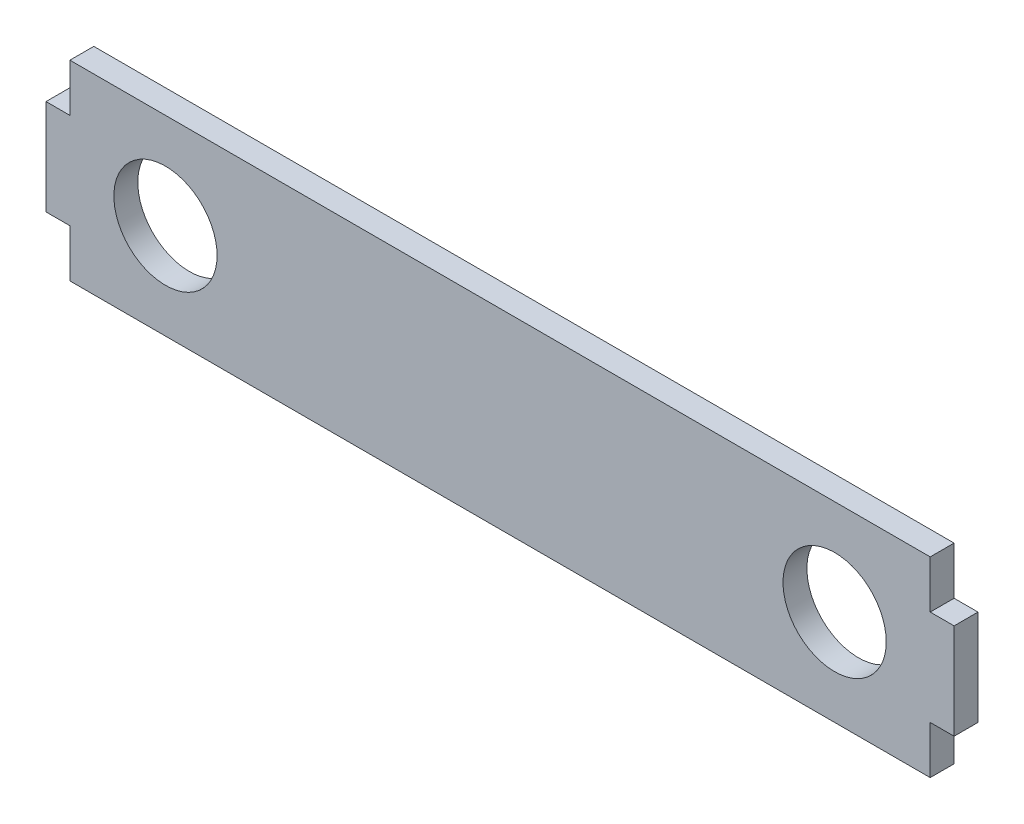
ISO-10303-21;
HEADER;
FILE_DESCRIPTION(('STEP AP214'),'2;1');
FILE_NAME('part.step','',(''),(''),'','','');
FILE_SCHEMA(('AUTOMOTIVE_DESIGN { 1 0 10303 214 1 1 1 1 }'));
ENDSEC;
DATA;
#1=APPLICATION_CONTEXT('core data for automotive mechanical design processes');
#2=APPLICATION_PROTOCOL_DEFINITION('international standard','automotive_design',2000,#1);
#3=PRODUCT_CONTEXT('',#1,'mechanical');
#4=PRODUCT('Part','Part','',(#3));
#5=PRODUCT_RELATED_PRODUCT_CATEGORY('part','',(#4));
#6=PRODUCT_DEFINITION_FORMATION('','',#4);
#7=PRODUCT_DEFINITION_CONTEXT('part definition',#1,'design');
#8=PRODUCT_DEFINITION('design','',#6,#7);
#9=PRODUCT_DEFINITION_SHAPE('','',#8);
#10=(LENGTH_UNIT() NAMED_UNIT(*) SI_UNIT(.MILLI.,.METRE.));
#11=(NAMED_UNIT(*) PLANE_ANGLE_UNIT() SI_UNIT($,.RADIAN.));
#12=(NAMED_UNIT(*) SI_UNIT($,.STERADIAN.) SOLID_ANGLE_UNIT());
#13=UNCERTAINTY_MEASURE_WITH_UNIT(LENGTH_MEASURE(1.E-05),#10,'distance_accuracy_value','');
#14=(GEOMETRIC_REPRESENTATION_CONTEXT(3) GLOBAL_UNCERTAINTY_ASSIGNED_CONTEXT((#13)) GLOBAL_UNIT_ASSIGNED_CONTEXT((#10,
#11,#12)) REPRESENTATION_CONTEXT('',''));
#15=CARTESIAN_POINT('',(0.,0.,0.));
#16=DIRECTION('',(0.,0.,1.));
#17=DIRECTION('',(1.,0.,0.));
#18=AXIS2_PLACEMENT_3D('',#15,#16,#17);
#19=CARTESIAN_POINT('',(-28.575,0.,-1.5875));
#20=DIRECTION('',(1.,0.,0.));
#21=DIRECTION('',(0.,0.,-1.));
#22=AXIS2_PLACEMENT_3D('',#19,#20,#21);
#23=PLANE('',#22);
#24=DIRECTION('',(0.,1.,0.));
#25=VECTOR('',#24,1.);
#26=CARTESIAN_POINT('',(-28.575,0.,0.));
#27=LINE('',#26,#25);
#28=CARTESIAN_POINT('',(-28.575,3.175,0.));
#29=VERTEX_POINT('',#28);
#30=CARTESIAN_POINT('',(-28.575,6.35,0.));
#31=VERTEX_POINT('',#30);
#32=EDGE_CURVE('E205',#29,#31,#27,.T.);
#33=ORIENTED_EDGE('',*,*,#32,.T.);
#34=DIRECTION('',(0.,0.,1.));
#35=VECTOR('',#34,1.);
#36=CARTESIAN_POINT('',(-28.575,6.35,-1.5875));
#37=LINE('',#36,#35);
#38=CARTESIAN_POINT('',(-28.575,6.35,-1.5875));
#39=VERTEX_POINT('',#38);
#40=EDGE_CURVE('E12',#39,#31,#37,.T.);
#41=ORIENTED_EDGE('',*,*,#40,.F.);
#42=DIRECTION('',(0.,1.,0.));
#43=VECTOR('',#42,1.);
#44=CARTESIAN_POINT('',(-28.575,0.,-1.5875));
#45=LINE('',#44,#43);
#46=CARTESIAN_POINT('',(-28.575,3.175,-1.5875));
#47=VERTEX_POINT('',#46);
#48=EDGE_CURVE('E71',#47,#39,#45,.T.);
#49=ORIENTED_EDGE('',*,*,#48,.F.);
#50=DIRECTION('',(0.,0.,1.));
#51=VECTOR('',#50,1.);
#52=CARTESIAN_POINT('',(-28.575,3.175,-1.5875));
#53=LINE('',#52,#51);
#54=EDGE_CURVE('E52',#47,#29,#53,.T.);
#55=ORIENTED_EDGE('',*,*,#54,.T.);
#56=EDGE_LOOP('',(#33,#41,#49,#55));
#57=FACE_BOUND('',#56,.T.);
#58=ADVANCED_FACE('F48',(#57),#23,.F.);
#59=CARTESIAN_POINT('',(0.,6.35,-1.5875));
#60=DIRECTION('',(0.,1.,0.));
#61=DIRECTION('',(0.,0.,1.));
#62=AXIS2_PLACEMENT_3D('',#59,#60,#61);
#63=PLANE('',#62);
#64=DIRECTION('',(-1.,0.,0.));
#65=VECTOR('',#64,1.);
#66=CARTESIAN_POINT('',(0.,6.35,0.));
#67=LINE('',#66,#65);
#68=CARTESIAN_POINT('',(28.575,6.35,0.));
#69=VERTEX_POINT('',#68);
#70=EDGE_CURVE('E257',#69,#31,#67,.T.);
#71=ORIENTED_EDGE('',*,*,#70,.F.);
#72=DIRECTION('',(0.,0.,1.));
#73=VECTOR('',#72,1.);
#74=CARTESIAN_POINT('',(28.575,6.35,-1.5875));
#75=LINE('',#74,#73);
#76=CARTESIAN_POINT('',(28.575,6.35,-1.5875));
#77=VERTEX_POINT('',#76);
#78=EDGE_CURVE('E59',#77,#69,#75,.T.);
#79=ORIENTED_EDGE('',*,*,#78,.F.);
#80=DIRECTION('',(-1.,0.,0.));
#81=VECTOR('',#80,1.);
#82=CARTESIAN_POINT('',(0.,6.35,-1.5875));
#83=LINE('',#82,#81);
#84=EDGE_CURVE('E182',#77,#39,#83,.T.);
#85=ORIENTED_EDGE('',*,*,#84,.T.);
#86=ORIENTED_EDGE('',*,*,#40,.T.);
#87=EDGE_LOOP('',(#71,#79,#85,#86));
#88=FACE_BOUND('',#87,.T.);
#89=ADVANCED_FACE('F311',(#88),#63,.T.);
#90=CARTESIAN_POINT('',(28.575,0.,-1.5875));
#91=DIRECTION('',(1.,0.,0.));
#92=DIRECTION('',(0.,1.,0.));
#93=AXIS2_PLACEMENT_3D('',#90,#91,#92);
#94=PLANE('',#93);
#95=DIRECTION('',(0.,1.,0.));
#96=VECTOR('',#95,1.);
#97=CARTESIAN_POINT('',(28.575,0.,0.));
#98=LINE('',#97,#96);
#99=CARTESIAN_POINT('',(28.575,3.175,0.));
#100=VERTEX_POINT('',#99);
#101=EDGE_CURVE('E166',#100,#69,#98,.T.);
#102=ORIENTED_EDGE('',*,*,#101,.F.);
#103=DIRECTION('',(0.,0.,1.));
#104=VECTOR('',#103,1.);
#105=CARTESIAN_POINT('',(28.575,3.175,-1.5875));
#106=LINE('',#105,#104);
#107=CARTESIAN_POINT('',(28.575,3.175,-1.5875));
#108=VERTEX_POINT('',#107);
#109=EDGE_CURVE('E161',#108,#100,#106,.T.);
#110=ORIENTED_EDGE('',*,*,#109,.F.);
#111=DIRECTION('',(0.,1.,0.));
#112=VECTOR('',#111,1.);
#113=CARTESIAN_POINT('',(28.575,0.,-1.5875));
#114=LINE('',#113,#112);
#115=EDGE_CURVE('E165',#108,#77,#114,.T.);
#116=ORIENTED_EDGE('',*,*,#115,.T.);
#117=ORIENTED_EDGE('',*,*,#78,.T.);
#118=EDGE_LOOP('',(#102,#110,#116,#117));
#119=FACE_BOUND('',#118,.T.);
#120=ADVANCED_FACE('F163',(#119),#94,.T.);
#121=CARTESIAN_POINT('',(0.,3.175,-1.5875));
#122=DIRECTION('',(0.,-1.,0.));
#123=DIRECTION('',(0.,0.,-1.));
#124=AXIS2_PLACEMENT_3D('',#121,#122,#123);
#125=PLANE('',#124);
#126=DIRECTION('',(1.,0.,0.));
#127=VECTOR('',#126,1.);
#128=CARTESIAN_POINT('',(0.,3.175,0.));
#129=LINE('',#128,#127);
#130=CARTESIAN_POINT('',(30.1625,3.175,0.));
#131=VERTEX_POINT('',#130);
#132=EDGE_CURVE('E251',#100,#131,#129,.T.);
#133=ORIENTED_EDGE('',*,*,#132,.T.);
#134=DIRECTION('',(0.,0.,1.));
#135=VECTOR('',#134,1.);
#136=CARTESIAN_POINT('',(30.1625,3.175,-1.5875));
#137=LINE('',#136,#135);
#138=CARTESIAN_POINT('',(30.1625,3.175,-1.5875));
#139=VERTEX_POINT('',#138);
#140=EDGE_CURVE('E171',#139,#131,#137,.T.);
#141=ORIENTED_EDGE('',*,*,#140,.F.);
#142=DIRECTION('',(1.,0.,0.));
#143=VECTOR('',#142,1.);
#144=CARTESIAN_POINT('',(0.,3.175,-1.5875));
#145=LINE('',#144,#143);
#146=EDGE_CURVE('E174',#108,#139,#145,.T.);
#147=ORIENTED_EDGE('',*,*,#146,.F.);
#148=ORIENTED_EDGE('',*,*,#109,.T.);
#149=EDGE_LOOP('',(#133,#141,#147,#148));
#150=FACE_BOUND('',#149,.T.);
#151=ADVANCED_FACE('F175',(#150),#125,.F.);
#152=CARTESIAN_POINT('',(30.1625,0.,-1.5875));
#153=DIRECTION('',(1.,0.,0.));
#154=DIRECTION('',(0.,0.,-1.));
#155=AXIS2_PLACEMENT_3D('',#152,#153,#154);
#156=PLANE('',#155);
#157=DIRECTION('',(0.,1.,0.));
#158=VECTOR('',#157,1.);
#159=CARTESIAN_POINT('',(30.1625,0.,0.));
#160=LINE('',#159,#158);
#161=CARTESIAN_POINT('',(30.1625,-3.175,0.));
#162=VERTEX_POINT('',#161);
#163=EDGE_CURVE('E247',#162,#131,#160,.T.);
#164=ORIENTED_EDGE('',*,*,#163,.F.);
#165=DIRECTION('',(0.,0.,1.));
#166=VECTOR('',#165,1.);
#167=CARTESIAN_POINT('',(30.1625,-3.175,-1.5875));
#168=LINE('',#167,#166);
#169=CARTESIAN_POINT('',(30.1625,-3.175,-1.5875));
#170=VERTEX_POINT('',#169);
#171=EDGE_CURVE('E267',#170,#162,#168,.T.);
#172=ORIENTED_EDGE('',*,*,#171,.F.);
#173=DIRECTION('',(0.,1.,0.));
#174=VECTOR('',#173,1.);
#175=CARTESIAN_POINT('',(30.1625,0.,-1.5875));
#176=LINE('',#175,#174);
#177=EDGE_CURVE('E179',#170,#139,#176,.T.);
#178=ORIENTED_EDGE('',*,*,#177,.T.);
#179=ORIENTED_EDGE('',*,*,#140,.T.);
#180=EDGE_LOOP('',(#164,#172,#178,#179));
#181=FACE_BOUND('',#180,.T.);
#182=ADVANCED_FACE('F429',(#181),#156,.T.);
#183=CARTESIAN_POINT('',(0.,-3.17499999999993,-1.5875));
#184=DIRECTION('',(0.,1.,0.));
#185=DIRECTION('',(-1.,0.,0.));
#186=AXIS2_PLACEMENT_3D('',#183,#184,#185);
#187=PLANE('',#186);
#188=DIRECTION('',(-1.,0.,0.));
#189=VECTOR('',#188,1.);
#190=CARTESIAN_POINT('',(0.,-3.17499999999993,0.));
#191=LINE('',#190,#189);
#192=CARTESIAN_POINT('',(28.575,-3.175,0.));
#193=VERTEX_POINT('',#192);
#194=EDGE_CURVE('E240',#162,#193,#191,.T.);
#195=ORIENTED_EDGE('',*,*,#194,.T.);
#196=DIRECTION('',(0.,0.,1.));
#197=VECTOR('',#196,1.);
#198=CARTESIAN_POINT('',(28.575,-3.175,-1.5875));
#199=LINE('',#198,#197);
#200=CARTESIAN_POINT('',(28.575,-3.175,-1.5875));
#201=VERTEX_POINT('',#200);
#202=EDGE_CURVE('E270',#201,#193,#199,.T.);
#203=ORIENTED_EDGE('',*,*,#202,.F.);
#204=DIRECTION('',(-1.,0.,0.));
#205=VECTOR('',#204,1.);
#206=CARTESIAN_POINT('',(0.,-3.17499999999993,-1.5875));
#207=LINE('',#206,#205);
#208=EDGE_CURVE('E377',#170,#201,#207,.T.);
#209=ORIENTED_EDGE('',*,*,#208,.F.);
#210=ORIENTED_EDGE('',*,*,#171,.T.);
#211=EDGE_LOOP('',(#195,#203,#209,#210));
#212=FACE_BOUND('',#211,.T.);
#213=ADVANCED_FACE('F427',(#212),#187,.F.);
#214=CARTESIAN_POINT('',(28.575,0.,-1.5875));
#215=DIRECTION('',(-1.,0.,0.));
#216=DIRECTION('',(0.,0.,1.));
#217=AXIS2_PLACEMENT_3D('',#214,#215,#216);
#218=PLANE('',#217);
#219=DIRECTION('',(0.,-1.,0.));
#220=VECTOR('',#219,1.);
#221=CARTESIAN_POINT('',(28.575,0.,0.));
#222=LINE('',#221,#220);
#223=CARTESIAN_POINT('',(28.575,-6.35,0.));
#224=VERTEX_POINT('',#223);
#225=EDGE_CURVE('E235',#193,#224,#222,.T.);
#226=ORIENTED_EDGE('',*,*,#225,.T.);
#227=DIRECTION('',(0.,0.,1.));
#228=VECTOR('',#227,1.);
#229=CARTESIAN_POINT('',(28.575,-6.35,-1.5875));
#230=LINE('',#229,#228);
#231=CARTESIAN_POINT('',(28.575,-6.35,-1.5875));
#232=VERTEX_POINT('',#231);
#233=EDGE_CURVE('E274',#232,#224,#230,.T.);
#234=ORIENTED_EDGE('',*,*,#233,.F.);
#235=DIRECTION('',(0.,-1.,0.));
#236=VECTOR('',#235,1.);
#237=CARTESIAN_POINT('',(28.575,0.,-1.5875));
#238=LINE('',#237,#236);
#239=EDGE_CURVE('E374',#201,#232,#238,.T.);
#240=ORIENTED_EDGE('',*,*,#239,.F.);
#241=ORIENTED_EDGE('',*,*,#202,.T.);
#242=EDGE_LOOP('',(#226,#234,#240,#241));
#243=FACE_BOUND('',#242,.T.);
#244=ADVANCED_FACE('F422',(#243),#218,.F.);
#245=CARTESIAN_POINT('',(0.,-6.35,-1.5875));
#246=DIRECTION('',(0.,-1.,0.));
#247=DIRECTION('',(0.,0.,-1.));
#248=AXIS2_PLACEMENT_3D('',#245,#246,#247);
#249=PLANE('',#248);
#250=DIRECTION('',(1.,0.,0.));
#251=VECTOR('',#250,1.);
#252=CARTESIAN_POINT('',(0.,-6.35,0.));
#253=LINE('',#252,#251);
#254=CARTESIAN_POINT('',(-28.575,-6.35,0.));
#255=VERTEX_POINT('',#254);
#256=EDGE_CURVE('E230',#255,#224,#253,.T.);
#257=ORIENTED_EDGE('',*,*,#256,.F.);
#258=DIRECTION('',(0.,0.,1.));
#259=VECTOR('',#258,1.);
#260=CARTESIAN_POINT('',(-28.575,-6.35,-1.5875));
#261=LINE('',#260,#259);
#262=CARTESIAN_POINT('',(-28.575,-6.35,-1.5875));
#263=VERTEX_POINT('',#262);
#264=EDGE_CURVE('E277',#263,#255,#261,.T.);
#265=ORIENTED_EDGE('',*,*,#264,.F.);
#266=DIRECTION('',(1.,0.,0.));
#267=VECTOR('',#266,1.);
#268=CARTESIAN_POINT('',(0.,-6.35,-1.5875));
#269=LINE('',#268,#267);
#270=EDGE_CURVE('E378',#263,#232,#269,.T.);
#271=ORIENTED_EDGE('',*,*,#270,.T.);
#272=ORIENTED_EDGE('',*,*,#233,.T.);
#273=EDGE_LOOP('',(#257,#265,#271,#272));
#274=FACE_BOUND('',#273,.T.);
#275=ADVANCED_FACE('F416',(#274),#249,.T.);
#276=CARTESIAN_POINT('',(-28.575,0.,-1.5875));
#277=DIRECTION('',(-1.,0.,0.));
#278=DIRECTION('',(0.,0.,1.));
#279=AXIS2_PLACEMENT_3D('',#276,#277,#278);
#280=PLANE('',#279);
#281=DIRECTION('',(0.,-1.,0.));
#282=VECTOR('',#281,1.);
#283=CARTESIAN_POINT('',(-28.575,0.,0.));
#284=LINE('',#283,#282);
#285=CARTESIAN_POINT('',(-28.575,-3.175,0.));
#286=VERTEX_POINT('',#285);
#287=EDGE_CURVE('E226',#286,#255,#284,.T.);
#288=ORIENTED_EDGE('',*,*,#287,.F.);
#289=DIRECTION('',(0.,0.,1.));
#290=VECTOR('',#289,1.);
#291=CARTESIAN_POINT('',(-28.575,-3.175,-1.5875));
#292=LINE('',#291,#290);
#293=CARTESIAN_POINT('',(-28.575,-3.175,-1.5875));
#294=VERTEX_POINT('',#293);
#295=EDGE_CURVE('E280',#294,#286,#292,.T.);
#296=ORIENTED_EDGE('',*,*,#295,.F.);
#297=DIRECTION('',(0.,-1.,0.));
#298=VECTOR('',#297,1.);
#299=CARTESIAN_POINT('',(-28.575,0.,-1.5875));
#300=LINE('',#299,#298);
#301=EDGE_CURVE('E387',#294,#263,#300,.T.);
#302=ORIENTED_EDGE('',*,*,#301,.T.);
#303=ORIENTED_EDGE('',*,*,#264,.T.);
#304=EDGE_LOOP('',(#288,#296,#302,#303));
#305=FACE_BOUND('',#304,.T.);
#306=ADVANCED_FACE('F412',(#305),#280,.T.);
#307=CARTESIAN_POINT('',(0.,-3.17500000000001,-1.5875));
#308=DIRECTION('',(0.,-1.,0.));
#309=DIRECTION('',(1.,0.,0.));
#310=AXIS2_PLACEMENT_3D('',#307,#308,#309);
#311=PLANE('',#310);
#312=DIRECTION('',(1.,0.,0.));
#313=VECTOR('',#312,1.);
#314=CARTESIAN_POINT('',(0.,-3.17500000000001,0.));
#315=LINE('',#314,#313);
#316=CARTESIAN_POINT('',(-30.1625,-3.175,0.));
#317=VERTEX_POINT('',#316);
#318=EDGE_CURVE('E218',#317,#286,#315,.T.);
#319=ORIENTED_EDGE('',*,*,#318,.F.);
#320=DIRECTION('',(0.,0.,1.));
#321=VECTOR('',#320,1.);
#322=CARTESIAN_POINT('',(-30.1625,-3.175,-1.5875));
#323=LINE('',#322,#321);
#324=CARTESIAN_POINT('',(-30.1625,-3.175,-1.5875));
#325=VERTEX_POINT('',#324);
#326=EDGE_CURVE('E283',#325,#317,#323,.T.);
#327=ORIENTED_EDGE('',*,*,#326,.F.);
#328=DIRECTION('',(1.,0.,0.));
#329=VECTOR('',#328,1.);
#330=CARTESIAN_POINT('',(0.,-3.17500000000001,-1.5875));
#331=LINE('',#330,#329);
#332=EDGE_CURVE('E357',#325,#294,#331,.T.);
#333=ORIENTED_EDGE('',*,*,#332,.T.);
#334=ORIENTED_EDGE('',*,*,#295,.T.);
#335=EDGE_LOOP('',(#319,#327,#333,#334));
#336=FACE_BOUND('',#335,.T.);
#337=ADVANCED_FACE('F322',(#336),#311,.T.);
#338=CARTESIAN_POINT('',(-30.1625,0.,-1.5875));
#339=DIRECTION('',(-1.,0.,0.));
#340=DIRECTION('',(0.,-1.,0.));
#341=AXIS2_PLACEMENT_3D('',#338,#339,#340);
#342=PLANE('',#341);
#343=DIRECTION('',(0.,-1.,0.));
#344=VECTOR('',#343,1.);
#345=CARTESIAN_POINT('',(-30.1625,0.,0.));
#346=LINE('',#345,#344);
#347=CARTESIAN_POINT('',(-30.1625,3.175,0.));
#348=VERTEX_POINT('',#347);
#349=EDGE_CURVE('E213',#348,#317,#346,.T.);
#350=ORIENTED_EDGE('',*,*,#349,.F.);
#351=DIRECTION('',(0.,0.,1.));
#352=VECTOR('',#351,1.);
#353=CARTESIAN_POINT('',(-30.1625,3.175,-1.5875));
#354=LINE('',#353,#352);
#355=CARTESIAN_POINT('',(-30.1625,3.175,-1.5875));
#356=VERTEX_POINT('',#355);
#357=EDGE_CURVE('E285',#356,#348,#354,.T.);
#358=ORIENTED_EDGE('',*,*,#357,.F.);
#359=DIRECTION('',(0.,-1.,0.));
#360=VECTOR('',#359,1.);
#361=CARTESIAN_POINT('',(-30.1625,0.,-1.5875));
#362=LINE('',#361,#360);
#363=EDGE_CURVE('E351',#356,#325,#362,.T.);
#364=ORIENTED_EDGE('',*,*,#363,.T.);
#365=ORIENTED_EDGE('',*,*,#326,.T.);
#366=EDGE_LOOP('',(#350,#358,#364,#365));
#367=FACE_BOUND('',#366,.T.);
#368=ADVANCED_FACE('F317',(#367),#342,.T.);
#369=CARTESIAN_POINT('',(22.225,0.,-1.5875));
#370=DIRECTION('',(0.,0.,1.));
#371=DIRECTION('',(1.,0.,0.));
#372=AXIS2_PLACEMENT_3D('',#369,#370,#371);
#373=CYLINDRICAL_SURFACE('',#372,3.429);
#374=CARTESIAN_POINT('',(22.225,0.,-1.5875));
#375=DIRECTION('',(0.,0.,1.));
#376=DIRECTION('',(1.,0.,0.));
#377=AXIS2_PLACEMENT_3D('',#374,#375,#376);
#378=CIRCLE('',#377,3.429);
#379=CARTESIAN_POINT('',(25.654,0.,-1.5875));
#380=VERTEX_POINT('',#379);
#381=EDGE_CURVE('E327',#380,#380,#378,.T.);
#382=ORIENTED_EDGE('',*,*,#381,.F.);
#383=EDGE_LOOP('',(#382));
#384=FACE_BOUND('',#383,.T.);
#385=CARTESIAN_POINT('',(22.225,0.,0.));
#386=DIRECTION('',(0.,0.,1.));
#387=DIRECTION('',(1.,0.,0.));
#388=AXIS2_PLACEMENT_3D('',#385,#386,#387);
#389=CIRCLE('',#388,3.429);
#390=CARTESIAN_POINT('',(25.654,0.,0.));
#391=VERTEX_POINT('',#390);
#392=EDGE_CURVE('E196',#391,#391,#389,.T.);
#393=ORIENTED_EDGE('',*,*,#392,.T.);
#394=EDGE_LOOP('',(#393));
#395=FACE_BOUND('',#394,.T.);
#396=ADVANCED_FACE('F306',(#384,#395),#373,.F.);
#397=CARTESIAN_POINT('',(-22.225,0.,-1.5875));
#398=DIRECTION('',(0.,0.,1.));
#399=DIRECTION('',(1.,0.,0.));
#400=AXIS2_PLACEMENT_3D('',#397,#398,#399);
#401=CYLINDRICAL_SURFACE('',#400,3.429);
#402=CARTESIAN_POINT('',(-22.225,0.,-1.5875));
#403=DIRECTION('',(0.,0.,1.));
#404=DIRECTION('',(1.,0.,0.));
#405=AXIS2_PLACEMENT_3D('',#402,#403,#404);
#406=CIRCLE('',#405,3.429);
#407=CARTESIAN_POINT('',(-18.796,0.,-1.5875));
#408=VERTEX_POINT('',#407);
#409=EDGE_CURVE('E261',#408,#408,#406,.T.);
#410=ORIENTED_EDGE('',*,*,#409,.F.);
#411=EDGE_LOOP('',(#410));
#412=FACE_BOUND('',#411,.T.);
#413=CARTESIAN_POINT('',(-22.225,0.,0.));
#414=DIRECTION('',(0.,0.,1.));
#415=DIRECTION('',(1.,0.,0.));
#416=AXIS2_PLACEMENT_3D('',#413,#414,#415);
#417=CIRCLE('',#416,3.429);
#418=CARTESIAN_POINT('',(-18.796,0.,0.));
#419=VERTEX_POINT('',#418);
#420=EDGE_CURVE('E191',#419,#419,#417,.T.);
#421=ORIENTED_EDGE('',*,*,#420,.T.);
#422=EDGE_LOOP('',(#421));
#423=FACE_BOUND('',#422,.T.);
#424=ADVANCED_FACE('F50',(#412,#423),#401,.F.);
#425=CARTESIAN_POINT('',(0.,3.175,-1.5875));
#426=DIRECTION('',(0.,1.,0.));
#427=DIRECTION('',(0.,0.,1.));
#428=AXIS2_PLACEMENT_3D('',#425,#426,#427);
#429=PLANE('',#428);
#430=DIRECTION('',(-1.,0.,0.));
#431=VECTOR('',#430,1.);
#432=CARTESIAN_POINT('',(0.,3.175,0.));
#433=LINE('',#432,#431);
#434=EDGE_CURVE('E208',#29,#348,#433,.T.);
#435=ORIENTED_EDGE('',*,*,#434,.F.);
#436=ORIENTED_EDGE('',*,*,#54,.F.);
#437=DIRECTION('',(-1.,0.,0.));
#438=VECTOR('',#437,1.);
#439=CARTESIAN_POINT('',(0.,3.175,-1.5875));
#440=LINE('',#439,#438);
#441=EDGE_CURVE('E345',#47,#356,#440,.T.);
#442=ORIENTED_EDGE('',*,*,#441,.T.);
#443=ORIENTED_EDGE('',*,*,#357,.T.);
#444=EDGE_LOOP('',(#435,#436,#442,#443));
#445=FACE_BOUND('',#444,.T.);
#446=ADVANCED_FACE('F297',(#445),#429,.T.);
#447=CARTESIAN_POINT('',(0.,0.,-1.5875));
#448=DIRECTION('',(0.,0.,1.));
#449=DIRECTION('',(1.,0.,0.));
#450=AXIS2_PLACEMENT_3D('',#447,#448,#449);
#451=PLANE('',#450);
#452=ORIENTED_EDGE('',*,*,#409,.T.);
#453=EDGE_LOOP('',(#452));
#454=FACE_BOUND('',#453,.T.);
#455=ORIENTED_EDGE('',*,*,#381,.T.);
#456=EDGE_LOOP('',(#455));
#457=FACE_BOUND('',#456,.T.);
#458=ORIENTED_EDGE('',*,*,#48,.T.);
#459=ORIENTED_EDGE('',*,*,#84,.F.);
#460=ORIENTED_EDGE('',*,*,#115,.F.);
#461=ORIENTED_EDGE('',*,*,#146,.T.);
#462=ORIENTED_EDGE('',*,*,#177,.F.);
#463=ORIENTED_EDGE('',*,*,#208,.T.);
#464=ORIENTED_EDGE('',*,*,#239,.T.);
#465=ORIENTED_EDGE('',*,*,#270,.F.);
#466=ORIENTED_EDGE('',*,*,#301,.F.);
#467=ORIENTED_EDGE('',*,*,#332,.F.);
#468=ORIENTED_EDGE('',*,*,#363,.F.);
#469=ORIENTED_EDGE('',*,*,#441,.F.);
#470=EDGE_LOOP('',(#458,#459,#460,#461,#462,#463,#464,#465,#466,#467,#468,#469));
#471=FACE_BOUND('',#470,.T.);
#472=ADVANCED_FACE('F181',(#454,#457,#471),#451,.F.);
#473=CARTESIAN_POINT('',(0.,0.,0.));
#474=DIRECTION('',(0.,0.,1.));
#475=DIRECTION('',(1.,0.,0.));
#476=AXIS2_PLACEMENT_3D('',#473,#474,#475);
#477=PLANE('',#476);
#478=ORIENTED_EDGE('',*,*,#420,.F.);
#479=EDGE_LOOP('',(#478));
#480=FACE_BOUND('',#479,.T.);
#481=ORIENTED_EDGE('',*,*,#392,.F.);
#482=EDGE_LOOP('',(#481));
#483=FACE_BOUND('',#482,.T.);
#484=ORIENTED_EDGE('',*,*,#32,.F.);
#485=ORIENTED_EDGE('',*,*,#434,.T.);
#486=ORIENTED_EDGE('',*,*,#349,.T.);
#487=ORIENTED_EDGE('',*,*,#318,.T.);
#488=ORIENTED_EDGE('',*,*,#287,.T.);
#489=ORIENTED_EDGE('',*,*,#256,.T.);
#490=ORIENTED_EDGE('',*,*,#225,.F.);
#491=ORIENTED_EDGE('',*,*,#194,.F.);
#492=ORIENTED_EDGE('',*,*,#163,.T.);
#493=ORIENTED_EDGE('',*,*,#132,.F.);
#494=ORIENTED_EDGE('',*,*,#101,.T.);
#495=ORIENTED_EDGE('',*,*,#70,.T.);
#496=EDGE_LOOP('',(#484,#485,#486,#487,#488,#489,#490,#491,#492,#493,#494,#495));
#497=FACE_BOUND('',#496,.T.);
#498=ADVANCED_FACE('F296',(#480,#483,#497),#477,.T.);
#499=CLOSED_SHELL('',(#58,#89,#120,#151,#182,#213,#244,#275,#306,#337,#368,#396,#424,#446,#472,#498));
#500=MANIFOLD_SOLID_BREP('B2',#499);
#501=ADVANCED_BREP_SHAPE_REPRESENTATION('',(#18,#500),#14);
#502=SHAPE_DEFINITION_REPRESENTATION(#9,#501);
ENDSEC;
END-ISO-10303-21;
